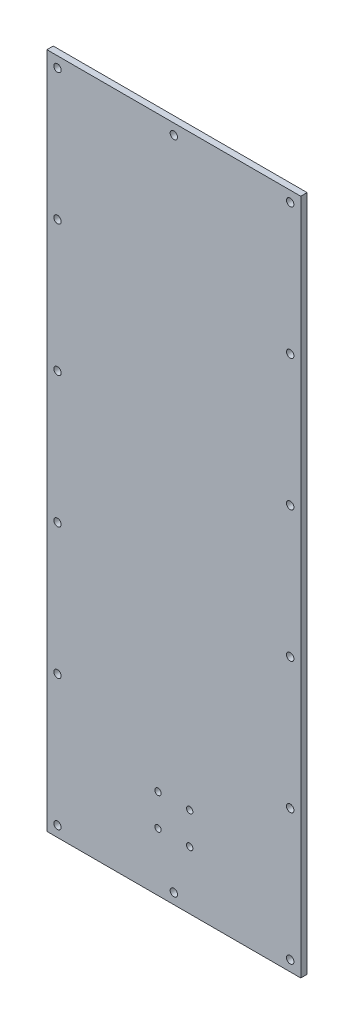
ISO-10303-21;
HEADER;
FILE_DESCRIPTION(('STEP AP214'),'2;1');
FILE_NAME('part.step','',(''),(''),'','','');
FILE_SCHEMA(('AUTOMOTIVE_DESIGN { 1 0 10303 214 1 1 1 1 }'));
ENDSEC;
DATA;
#1=APPLICATION_CONTEXT('core data for automotive mechanical design processes');
#2=APPLICATION_PROTOCOL_DEFINITION('international standard','automotive_design',2000,#1);
#3=PRODUCT_CONTEXT('',#1,'mechanical');
#4=PRODUCT('Part','Part','',(#3));
#5=PRODUCT_RELATED_PRODUCT_CATEGORY('part','',(#4));
#6=PRODUCT_DEFINITION_FORMATION('','',#4);
#7=PRODUCT_DEFINITION_CONTEXT('part definition',#1,'design');
#8=PRODUCT_DEFINITION('design','',#6,#7);
#9=PRODUCT_DEFINITION_SHAPE('','',#8);
#10=(LENGTH_UNIT() NAMED_UNIT(*) SI_UNIT(.MILLI.,.METRE.));
#11=(NAMED_UNIT(*) PLANE_ANGLE_UNIT() SI_UNIT($,.RADIAN.));
#12=(NAMED_UNIT(*) SI_UNIT($,.STERADIAN.) SOLID_ANGLE_UNIT());
#13=UNCERTAINTY_MEASURE_WITH_UNIT(LENGTH_MEASURE(1.E-05),#10,'distance_accuracy_value','');
#14=(GEOMETRIC_REPRESENTATION_CONTEXT(3) GLOBAL_UNCERTAINTY_ASSIGNED_CONTEXT((#13)) GLOBAL_UNIT_ASSIGNED_CONTEXT((#10,
#11,#12)) REPRESENTATION_CONTEXT('',''));
#15=CARTESIAN_POINT('',(0.,0.,0.));
#16=DIRECTION('',(0.,0.,1.));
#17=DIRECTION('',(1.,0.,0.));
#18=AXIS2_PLACEMENT_3D('',#15,#16,#17);
#19=CARTESIAN_POINT('',(-60.,-160.,3.));
#20=DIRECTION('',(1.,0.,0.));
#21=DIRECTION('',(0.,0.,-1.));
#22=AXIS2_PLACEMENT_3D('',#19,#20,#21);
#23=PLANE('',#22);
#24=DIRECTION('',(0.,-1.,0.));
#25=VECTOR('',#24,1.);
#26=CARTESIAN_POINT('',(-60.,-160.,0.));
#27=LINE('',#26,#25);
#28=CARTESIAN_POINT('',(-60.,160.,0.));
#29=VERTEX_POINT('',#28);
#30=CARTESIAN_POINT('',(-60.,-160.,0.));
#31=VERTEX_POINT('',#30);
#32=EDGE_CURVE('E101',#29,#31,#27,.T.);
#33=ORIENTED_EDGE('',*,*,#32,.T.);
#34=DIRECTION('',(0.,0.,-1.));
#35=VECTOR('',#34,1.);
#36=CARTESIAN_POINT('',(-60.,-160.,3.));
#37=LINE('',#36,#35);
#38=CARTESIAN_POINT('',(-60.,-160.,3.));
#39=VERTEX_POINT('',#38);
#40=EDGE_CURVE('E11',#39,#31,#37,.T.);
#41=ORIENTED_EDGE('',*,*,#40,.F.);
#42=DIRECTION('',(0.,-1.,0.));
#43=VECTOR('',#42,1.);
#44=CARTESIAN_POINT('',(-60.,-160.,3.));
#45=LINE('',#44,#43);
#46=CARTESIAN_POINT('',(-60.,160.,3.));
#47=VERTEX_POINT('',#46);
#48=EDGE_CURVE('E88',#47,#39,#45,.T.);
#49=ORIENTED_EDGE('',*,*,#48,.F.);
#50=DIRECTION('',(0.,0.,-1.));
#51=VECTOR('',#50,1.);
#52=CARTESIAN_POINT('',(-60.,160.,3.));
#53=LINE('',#52,#51);
#54=EDGE_CURVE('E97',#47,#29,#53,.T.);
#55=ORIENTED_EDGE('',*,*,#54,.T.);
#56=EDGE_LOOP('',(#33,#41,#49,#55));
#57=FACE_BOUND('',#56,.T.);
#58=ADVANCED_FACE('F35',(#57),#23,.F.);
#59=CARTESIAN_POINT('',(60.,-160.,3.));
#60=DIRECTION('',(0.,1.,0.));
#61=DIRECTION('',(0.,0.,1.));
#62=AXIS2_PLACEMENT_3D('',#59,#60,#61);
#63=PLANE('',#62);
#64=DIRECTION('',(1.,0.,0.));
#65=VECTOR('',#64,1.);
#66=CARTESIAN_POINT('',(60.,-160.,0.));
#67=LINE('',#66,#65);
#68=CARTESIAN_POINT('',(60.,-160.,0.));
#69=VERTEX_POINT('',#68);
#70=EDGE_CURVE('E92',#31,#69,#67,.T.);
#71=ORIENTED_EDGE('',*,*,#70,.T.);
#72=DIRECTION('',(0.,0.,-1.));
#73=VECTOR('',#72,1.);
#74=CARTESIAN_POINT('',(60.,-160.,3.));
#75=LINE('',#74,#73);
#76=CARTESIAN_POINT('',(60.,-160.,3.));
#77=VERTEX_POINT('',#76);
#78=EDGE_CURVE('E44',#77,#69,#75,.T.);
#79=ORIENTED_EDGE('',*,*,#78,.F.);
#80=DIRECTION('',(1.,0.,0.));
#81=VECTOR('',#80,1.);
#82=CARTESIAN_POINT('',(60.,-160.,3.));
#83=LINE('',#82,#81);
#84=EDGE_CURVE('E83',#39,#77,#83,.T.);
#85=ORIENTED_EDGE('',*,*,#84,.F.);
#86=ORIENTED_EDGE('',*,*,#40,.T.);
#87=EDGE_LOOP('',(#71,#79,#85,#86));
#88=FACE_BOUND('',#87,.T.);
#89=ADVANCED_FACE('F91',(#88),#63,.F.);
#90=CARTESIAN_POINT('',(60.,-160.,3.));
#91=DIRECTION('',(-1.,0.,0.));
#92=DIRECTION('',(0.,0.,1.));
#93=AXIS2_PLACEMENT_3D('',#90,#91,#92);
#94=PLANE('',#93);
#95=DIRECTION('',(0.,1.,0.));
#96=VECTOR('',#95,1.);
#97=CARTESIAN_POINT('',(60.,-160.,0.));
#98=LINE('',#97,#96);
#99=CARTESIAN_POINT('',(60.,160.,0.));
#100=VERTEX_POINT('',#99);
#101=EDGE_CURVE('E70',#69,#100,#98,.T.);
#102=ORIENTED_EDGE('',*,*,#101,.T.);
#103=DIRECTION('',(0.,0.,-1.));
#104=VECTOR('',#103,1.);
#105=CARTESIAN_POINT('',(60.,160.,3.));
#106=LINE('',#105,#104);
#107=CARTESIAN_POINT('',(60.,160.,3.));
#108=VERTEX_POINT('',#107);
#109=EDGE_CURVE('E93',#108,#100,#106,.T.);
#110=ORIENTED_EDGE('',*,*,#109,.F.);
#111=DIRECTION('',(0.,1.,0.));
#112=VECTOR('',#111,1.);
#113=CARTESIAN_POINT('',(60.,-160.,3.));
#114=LINE('',#113,#112);
#115=EDGE_CURVE('E86',#77,#108,#114,.T.);
#116=ORIENTED_EDGE('',*,*,#115,.F.);
#117=ORIENTED_EDGE('',*,*,#78,.T.);
#118=EDGE_LOOP('',(#102,#110,#116,#117));
#119=FACE_BOUND('',#118,.T.);
#120=ADVANCED_FACE('F95',(#119),#94,.F.);
#121=CARTESIAN_POINT('',(60.,160.,3.));
#122=DIRECTION('',(0.,-1.,0.));
#123=DIRECTION('',(0.,0.,-1.));
#124=AXIS2_PLACEMENT_3D('',#121,#122,#123);
#125=PLANE('',#124);
#126=DIRECTION('',(-1.,0.,0.));
#127=VECTOR('',#126,1.);
#128=CARTESIAN_POINT('',(60.,160.,0.));
#129=LINE('',#128,#127);
#130=EDGE_CURVE('E76',#100,#29,#129,.T.);
#131=ORIENTED_EDGE('',*,*,#130,.T.);
#132=ORIENTED_EDGE('',*,*,#54,.F.);
#133=DIRECTION('',(-1.,0.,0.));
#134=VECTOR('',#133,1.);
#135=CARTESIAN_POINT('',(60.,160.,3.));
#136=LINE('',#135,#134);
#137=EDGE_CURVE('E53',#108,#47,#136,.T.);
#138=ORIENTED_EDGE('',*,*,#137,.F.);
#139=ORIENTED_EDGE('',*,*,#109,.T.);
#140=EDGE_LOOP('',(#131,#132,#138,#139));
#141=FACE_BOUND('',#140,.T.);
#142=ADVANCED_FACE('F196',(#141),#125,.F.);
#143=CARTESIAN_POINT('',(0.,0.,3.));
#144=DIRECTION('',(0.,0.,1.));
#145=DIRECTION('',(1.,0.,0.));
#146=AXIS2_PLACEMENT_3D('',#143,#144,#145);
#147=PLANE('',#146);
#148=CARTESIAN_POINT('',(55.,-31.0000000000001,3.));
#149=DIRECTION('',(0.,0.,1.));
#150=DIRECTION('',(-1.,0.,0.));
#151=AXIS2_PLACEMENT_3D('',#148,#149,#150);
#152=CIRCLE('',#151,1.74759299465095);
#153=CARTESIAN_POINT('',(53.252407005349,-31.0000000000001,3.));
#154=VERTEX_POINT('',#153);
#155=EDGE_CURVE('E447',#154,#154,#152,.T.);
#156=ORIENTED_EDGE('',*,*,#155,.F.);
#157=EDGE_LOOP('',(#156));
#158=FACE_BOUND('',#157,.T.);
#159=CARTESIAN_POINT('',(55.,31.,3.));
#160=DIRECTION('',(0.,0.,1.));
#161=DIRECTION('',(-1.,0.,0.));
#162=AXIS2_PLACEMENT_3D('',#159,#160,#161);
#163=CIRCLE('',#162,1.74759299465095);
#164=CARTESIAN_POINT('',(53.252407005349,31.,3.));
#165=VERTEX_POINT('',#164);
#166=EDGE_CURVE('E441',#165,#165,#163,.T.);
#167=ORIENTED_EDGE('',*,*,#166,.F.);
#168=EDGE_LOOP('',(#167));
#169=FACE_BOUND('',#168,.T.);
#170=CARTESIAN_POINT('',(55.,93.,3.));
#171=DIRECTION('',(0.,0.,1.));
#172=DIRECTION('',(-1.,0.,0.));
#173=AXIS2_PLACEMENT_3D('',#170,#171,#172);
#174=CIRCLE('',#173,1.74759299465095);
#175=CARTESIAN_POINT('',(53.2524070053491,93.,3.));
#176=VERTEX_POINT('',#175);
#177=EDGE_CURVE('E391',#176,#176,#174,.T.);
#178=ORIENTED_EDGE('',*,*,#177,.F.);
#179=EDGE_LOOP('',(#178));
#180=FACE_BOUND('',#179,.T.);
#181=CARTESIAN_POINT('',(54.9999999999998,-155.,3.));
#182=DIRECTION('',(0.,0.,1.));
#183=DIRECTION('',(-1.,0.,0.));
#184=AXIS2_PLACEMENT_3D('',#181,#182,#183);
#185=CIRCLE('',#184,1.74759299465095);
#186=CARTESIAN_POINT('',(53.2524070053489,-155.,3.));
#187=VERTEX_POINT('',#186);
#188=EDGE_CURVE('E440',#187,#187,#185,.T.);
#189=ORIENTED_EDGE('',*,*,#188,.F.);
#190=EDGE_LOOP('',(#189));
#191=FACE_BOUND('',#190,.T.);
#192=CARTESIAN_POINT('',(7.50000000000001,-132.5,3.));
#193=DIRECTION('',(0.,0.,1.));
#194=DIRECTION('',(1.,0.,0.));
#195=AXIS2_PLACEMENT_3D('',#192,#193,#194);
#196=CIRCLE('',#195,1.5);
#197=CARTESIAN_POINT('',(9.00000000000001,-132.5,3.));
#198=VERTEX_POINT('',#197);
#199=EDGE_CURVE('E497',#198,#198,#196,.T.);
#200=ORIENTED_EDGE('',*,*,#199,.F.);
#201=EDGE_LOOP('',(#200));
#202=FACE_BOUND('',#201,.T.);
#203=CARTESIAN_POINT('',(7.50000000000001,-117.5,3.));
#204=DIRECTION('',(0.,0.,1.));
#205=DIRECTION('',(1.,0.,0.));
#206=AXIS2_PLACEMENT_3D('',#203,#204,#205);
#207=CIRCLE('',#206,1.5);
#208=CARTESIAN_POINT('',(9.00000000000001,-117.5,3.));
#209=VERTEX_POINT('',#208);
#210=EDGE_CURVE('E500',#209,#209,#207,.T.);
#211=ORIENTED_EDGE('',*,*,#210,.F.);
#212=EDGE_LOOP('',(#211));
#213=FACE_BOUND('',#212,.T.);
#214=CARTESIAN_POINT('',(-7.49999999999999,-117.5,3.));
#215=DIRECTION('',(0.,0.,1.));
#216=DIRECTION('',(1.,0.,0.));
#217=AXIS2_PLACEMENT_3D('',#214,#215,#216);
#218=CIRCLE('',#217,1.5);
#219=CARTESIAN_POINT('',(-5.99999999999999,-117.5,3.));
#220=VERTEX_POINT('',#219);
#221=EDGE_CURVE('E504',#220,#220,#218,.T.);
#222=ORIENTED_EDGE('',*,*,#221,.F.);
#223=EDGE_LOOP('',(#222));
#224=FACE_BOUND('',#223,.T.);
#225=CARTESIAN_POINT('',(55.,-93.0000000000001,3.));
#226=DIRECTION('',(0.,0.,1.));
#227=DIRECTION('',(-1.,0.,0.));
#228=AXIS2_PLACEMENT_3D('',#225,#226,#227);
#229=CIRCLE('',#228,1.74759299465095);
#230=CARTESIAN_POINT('',(53.252407005349,-93.0000000000001,3.));
#231=VERTEX_POINT('',#230);
#232=EDGE_CURVE('E506',#231,#231,#229,.T.);
#233=ORIENTED_EDGE('',*,*,#232,.F.);
#234=EDGE_LOOP('',(#233));
#235=FACE_BOUND('',#234,.T.);
#236=CARTESIAN_POINT('',(-1.43403807347416E-13,-155.,3.));
#237=DIRECTION('',(0.,0.,1.));
#238=DIRECTION('',(-1.,0.,0.));
#239=AXIS2_PLACEMENT_3D('',#236,#237,#238);
#240=CIRCLE('',#239,1.74759299465095);
#241=CARTESIAN_POINT('',(-1.74759299465109,-155.,3.));
#242=VERTEX_POINT('',#241);
#243=EDGE_CURVE('E444',#242,#242,#240,.T.);
#244=ORIENTED_EDGE('',*,*,#243,.F.);
#245=EDGE_LOOP('',(#244));
#246=FACE_BOUND('',#245,.T.);
#247=CARTESIAN_POINT('',(-55.,-155.,3.));
#248=DIRECTION('',(0.,0.,1.));
#249=DIRECTION('',(1.,0.,0.));
#250=AXIS2_PLACEMENT_3D('',#247,#248,#249);
#251=CIRCLE('',#250,1.74759299465095);
#252=CARTESIAN_POINT('',(-53.252407005349,-155.,3.));
#253=VERTEX_POINT('',#252);
#254=EDGE_CURVE('E469',#253,#253,#251,.T.);
#255=ORIENTED_EDGE('',*,*,#254,.F.);
#256=EDGE_LOOP('',(#255));
#257=FACE_BOUND('',#256,.T.);
#258=CARTESIAN_POINT('',(-55.,-93.0000000000001,3.));
#259=DIRECTION('',(0.,0.,1.));
#260=DIRECTION('',(1.,0.,0.));
#261=AXIS2_PLACEMENT_3D('',#258,#259,#260);
#262=CIRCLE('',#261,1.74759299465095);
#263=CARTESIAN_POINT('',(-53.252407005349,-93.0000000000001,3.));
#264=VERTEX_POINT('',#263);
#265=EDGE_CURVE('E466',#264,#264,#262,.T.);
#266=ORIENTED_EDGE('',*,*,#265,.F.);
#267=EDGE_LOOP('',(#266));
#268=FACE_BOUND('',#267,.T.);
#269=CARTESIAN_POINT('',(-55.,-31.0000000000001,3.));
#270=DIRECTION('',(0.,0.,1.));
#271=DIRECTION('',(1.,0.,0.));
#272=AXIS2_PLACEMENT_3D('',#269,#270,#271);
#273=CIRCLE('',#272,1.74759299465095);
#274=CARTESIAN_POINT('',(-53.252407005349,-31.0000000000001,3.));
#275=VERTEX_POINT('',#274);
#276=EDGE_CURVE('E463',#275,#275,#273,.T.);
#277=ORIENTED_EDGE('',*,*,#276,.F.);
#278=EDGE_LOOP('',(#277));
#279=FACE_BOUND('',#278,.T.);
#280=CARTESIAN_POINT('',(-55.,31.,3.));
#281=DIRECTION('',(0.,0.,1.));
#282=DIRECTION('',(1.,0.,0.));
#283=AXIS2_PLACEMENT_3D('',#280,#281,#282);
#284=CIRCLE('',#283,1.74759299465095);
#285=CARTESIAN_POINT('',(-53.252407005349,31.,3.));
#286=VERTEX_POINT('',#285);
#287=EDGE_CURVE('E460',#286,#286,#284,.T.);
#288=ORIENTED_EDGE('',*,*,#287,.F.);
#289=EDGE_LOOP('',(#288));
#290=FACE_BOUND('',#289,.T.);
#291=CARTESIAN_POINT('',(-55.,93.,3.));
#292=DIRECTION('',(0.,0.,1.));
#293=DIRECTION('',(1.,0.,0.));
#294=AXIS2_PLACEMENT_3D('',#291,#292,#293);
#295=CIRCLE('',#294,1.74759299465095);
#296=CARTESIAN_POINT('',(-53.252407005349,93.,3.));
#297=VERTEX_POINT('',#296);
#298=EDGE_CURVE('E457',#297,#297,#295,.T.);
#299=ORIENTED_EDGE('',*,*,#298,.F.);
#300=EDGE_LOOP('',(#299));
#301=FACE_BOUND('',#300,.T.);
#302=CARTESIAN_POINT('',(55.,155.,3.));
#303=DIRECTION('',(0.,0.,1.));
#304=DIRECTION('',(1.,0.,0.));
#305=AXIS2_PLACEMENT_3D('',#302,#303,#304);
#306=CIRCLE('',#305,1.74759299465095);
#307=CARTESIAN_POINT('',(56.7475929946509,155.,3.));
#308=VERTEX_POINT('',#307);
#309=EDGE_CURVE('E454',#308,#308,#306,.T.);
#310=ORIENTED_EDGE('',*,*,#309,.F.);
#311=EDGE_LOOP('',(#310));
#312=FACE_BOUND('',#311,.T.);
#313=CARTESIAN_POINT('',(0.,155.,3.));
#314=DIRECTION('',(0.,0.,1.));
#315=DIRECTION('',(1.,0.,0.));
#316=AXIS2_PLACEMENT_3D('',#313,#314,#315);
#317=CIRCLE('',#316,1.74759299465095);
#318=CARTESIAN_POINT('',(1.74759299465095,155.,3.));
#319=VERTEX_POINT('',#318);
#320=EDGE_CURVE('E451',#319,#319,#317,.T.);
#321=ORIENTED_EDGE('',*,*,#320,.F.);
#322=EDGE_LOOP('',(#321));
#323=FACE_BOUND('',#322,.T.);
#324=CARTESIAN_POINT('',(-7.49999999999999,-132.5,3.));
#325=DIRECTION('',(0.,0.,1.));
#326=DIRECTION('',(1.,0.,0.));
#327=AXIS2_PLACEMENT_3D('',#324,#325,#326);
#328=CIRCLE('',#327,1.5);
#329=CARTESIAN_POINT('',(-5.99999999999999,-132.5,3.));
#330=VERTEX_POINT('',#329);
#331=EDGE_CURVE('E496',#330,#330,#328,.T.);
#332=ORIENTED_EDGE('',*,*,#331,.F.);
#333=EDGE_LOOP('',(#332));
#334=FACE_BOUND('',#333,.T.);
#335=CARTESIAN_POINT('',(-55.,155.,3.));
#336=DIRECTION('',(0.,0.,1.));
#337=DIRECTION('',(1.,0.,0.));
#338=AXIS2_PLACEMENT_3D('',#335,#336,#337);
#339=CIRCLE('',#338,1.74759299465095);
#340=CARTESIAN_POINT('',(-53.2524070053491,155.,3.));
#341=VERTEX_POINT('',#340);
#342=EDGE_CURVE('E113',#341,#341,#339,.T.);
#343=ORIENTED_EDGE('',*,*,#342,.F.);
#344=EDGE_LOOP('',(#343));
#345=FACE_BOUND('',#344,.T.);
#346=ORIENTED_EDGE('',*,*,#48,.T.);
#347=ORIENTED_EDGE('',*,*,#84,.T.);
#348=ORIENTED_EDGE('',*,*,#115,.T.);
#349=ORIENTED_EDGE('',*,*,#137,.T.);
#350=EDGE_LOOP('',(#346,#347,#348,#349));
#351=FACE_BOUND('',#350,.T.);
#352=ADVANCED_FACE('F84',(#158,#169,#180,#191,#202,#213,#224,#235,#246,#257,#268,#279,#290,#301,
#312,#323,#334,#345,#351),#147,.T.);
#353=CARTESIAN_POINT('',(0.,0.,0.));
#354=DIRECTION('',(0.,0.,1.));
#355=DIRECTION('',(1.,0.,0.));
#356=AXIS2_PLACEMENT_3D('',#353,#354,#355);
#357=PLANE('',#356);
#358=CARTESIAN_POINT('',(55.,-31.0000000000001,0.));
#359=DIRECTION('',(0.,0.,1.));
#360=DIRECTION('',(1.,0.,0.));
#361=AXIS2_PLACEMENT_3D('',#358,#359,#360);
#362=CIRCLE('',#361,1.74759299465095);
#363=CARTESIAN_POINT('',(56.7475929946509,-31.0000000000001,0.));
#364=VERTEX_POINT('',#363);
#365=EDGE_CURVE('E38',#364,#364,#362,.T.);
#366=ORIENTED_EDGE('',*,*,#365,.T.);
#367=EDGE_LOOP('',(#366));
#368=FACE_BOUND('',#367,.T.);
#369=CARTESIAN_POINT('',(55.,31.,0.));
#370=DIRECTION('',(0.,0.,1.));
#371=DIRECTION('',(1.,0.,0.));
#372=AXIS2_PLACEMENT_3D('',#369,#370,#371);
#373=CIRCLE('',#372,1.74759299465095);
#374=CARTESIAN_POINT('',(56.7475929946509,31.,0.));
#375=VERTEX_POINT('',#374);
#376=EDGE_CURVE('E157',#375,#375,#373,.T.);
#377=ORIENTED_EDGE('',*,*,#376,.T.);
#378=EDGE_LOOP('',(#377));
#379=FACE_BOUND('',#378,.T.);
#380=CARTESIAN_POINT('',(55.,93.,0.));
#381=DIRECTION('',(0.,0.,1.));
#382=DIRECTION('',(1.,0.,0.));
#383=AXIS2_PLACEMENT_3D('',#380,#381,#382);
#384=CIRCLE('',#383,1.74759299465095);
#385=CARTESIAN_POINT('',(56.747592994651,93.,0.));
#386=VERTEX_POINT('',#385);
#387=EDGE_CURVE('E155',#386,#386,#384,.T.);
#388=ORIENTED_EDGE('',*,*,#387,.T.);
#389=EDGE_LOOP('',(#388));
#390=FACE_BOUND('',#389,.T.);
#391=CARTESIAN_POINT('',(54.9999999999998,-155.,0.));
#392=DIRECTION('',(0.,0.,1.));
#393=DIRECTION('',(1.,0.,0.));
#394=AXIS2_PLACEMENT_3D('',#391,#392,#393);
#395=CIRCLE('',#394,1.74759299465095);
#396=CARTESIAN_POINT('',(56.7475929946508,-155.,0.));
#397=VERTEX_POINT('',#396);
#398=EDGE_CURVE('E152',#397,#397,#395,.T.);
#399=ORIENTED_EDGE('',*,*,#398,.T.);
#400=EDGE_LOOP('',(#399));
#401=FACE_BOUND('',#400,.T.);
#402=CARTESIAN_POINT('',(7.50000000000001,-132.5,0.));
#403=DIRECTION('',(0.,0.,1.));
#404=DIRECTION('',(1.,0.,0.));
#405=AXIS2_PLACEMENT_3D('',#402,#403,#404);
#406=CIRCLE('',#405,1.5);
#407=CARTESIAN_POINT('',(9.00000000000001,-132.5,0.));
#408=VERTEX_POINT('',#407);
#409=EDGE_CURVE('E149',#408,#408,#406,.T.);
#410=ORIENTED_EDGE('',*,*,#409,.T.);
#411=EDGE_LOOP('',(#410));
#412=FACE_BOUND('',#411,.T.);
#413=CARTESIAN_POINT('',(7.50000000000001,-117.5,0.));
#414=DIRECTION('',(0.,0.,1.));
#415=DIRECTION('',(1.,0.,0.));
#416=AXIS2_PLACEMENT_3D('',#413,#414,#415);
#417=CIRCLE('',#416,1.5);
#418=CARTESIAN_POINT('',(9.00000000000001,-117.5,0.));
#419=VERTEX_POINT('',#418);
#420=EDGE_CURVE('E146',#419,#419,#417,.T.);
#421=ORIENTED_EDGE('',*,*,#420,.T.);
#422=EDGE_LOOP('',(#421));
#423=FACE_BOUND('',#422,.T.);
#424=CARTESIAN_POINT('',(-7.49999999999999,-117.5,0.));
#425=DIRECTION('',(0.,0.,1.));
#426=DIRECTION('',(1.,0.,0.));
#427=AXIS2_PLACEMENT_3D('',#424,#425,#426);
#428=CIRCLE('',#427,1.5);
#429=CARTESIAN_POINT('',(-5.99999999999999,-117.5,0.));
#430=VERTEX_POINT('',#429);
#431=EDGE_CURVE('E143',#430,#430,#428,.T.);
#432=ORIENTED_EDGE('',*,*,#431,.T.);
#433=EDGE_LOOP('',(#432));
#434=FACE_BOUND('',#433,.T.);
#435=CARTESIAN_POINT('',(55.,-93.0000000000001,0.));
#436=DIRECTION('',(0.,0.,1.));
#437=DIRECTION('',(1.,0.,0.));
#438=AXIS2_PLACEMENT_3D('',#435,#436,#437);
#439=CIRCLE('',#438,1.74759299465095);
#440=CARTESIAN_POINT('',(56.7475929946509,-93.0000000000001,0.));
#441=VERTEX_POINT('',#440);
#442=EDGE_CURVE('E140',#441,#441,#439,.T.);
#443=ORIENTED_EDGE('',*,*,#442,.T.);
#444=EDGE_LOOP('',(#443));
#445=FACE_BOUND('',#444,.T.);
#446=CARTESIAN_POINT('',(-1.43403807347416E-13,-155.,0.));
#447=DIRECTION('',(0.,0.,1.));
#448=DIRECTION('',(1.,0.,0.));
#449=AXIS2_PLACEMENT_3D('',#446,#447,#448);
#450=CIRCLE('',#449,1.74759299465095);
#451=CARTESIAN_POINT('',(1.7475929946508,-155.,0.));
#452=VERTEX_POINT('',#451);
#453=EDGE_CURVE('E137',#452,#452,#450,.T.);
#454=ORIENTED_EDGE('',*,*,#453,.T.);
#455=EDGE_LOOP('',(#454));
#456=FACE_BOUND('',#455,.T.);
#457=CARTESIAN_POINT('',(-55.,-155.,0.));
#458=DIRECTION('',(0.,0.,1.));
#459=DIRECTION('',(1.,0.,0.));
#460=AXIS2_PLACEMENT_3D('',#457,#458,#459);
#461=CIRCLE('',#460,1.74759299465095);
#462=CARTESIAN_POINT('',(-53.252407005349,-155.,0.));
#463=VERTEX_POINT('',#462);
#464=EDGE_CURVE('E134',#463,#463,#461,.T.);
#465=ORIENTED_EDGE('',*,*,#464,.T.);
#466=EDGE_LOOP('',(#465));
#467=FACE_BOUND('',#466,.T.);
#468=CARTESIAN_POINT('',(-55.,-93.0000000000001,0.));
#469=DIRECTION('',(0.,0.,1.));
#470=DIRECTION('',(1.,0.,0.));
#471=AXIS2_PLACEMENT_3D('',#468,#469,#470);
#472=CIRCLE('',#471,1.74759299465095);
#473=CARTESIAN_POINT('',(-53.252407005349,-93.0000000000001,0.));
#474=VERTEX_POINT('',#473);
#475=EDGE_CURVE('E131',#474,#474,#472,.T.);
#476=ORIENTED_EDGE('',*,*,#475,.T.);
#477=EDGE_LOOP('',(#476));
#478=FACE_BOUND('',#477,.T.);
#479=CARTESIAN_POINT('',(-55.,-31.0000000000001,0.));
#480=DIRECTION('',(0.,0.,1.));
#481=DIRECTION('',(1.,0.,0.));
#482=AXIS2_PLACEMENT_3D('',#479,#480,#481);
#483=CIRCLE('',#482,1.74759299465095);
#484=CARTESIAN_POINT('',(-53.252407005349,-31.0000000000001,0.));
#485=VERTEX_POINT('',#484);
#486=EDGE_CURVE('E128',#485,#485,#483,.T.);
#487=ORIENTED_EDGE('',*,*,#486,.T.);
#488=EDGE_LOOP('',(#487));
#489=FACE_BOUND('',#488,.T.);
#490=CARTESIAN_POINT('',(-55.,31.,0.));
#491=DIRECTION('',(0.,0.,1.));
#492=DIRECTION('',(1.,0.,0.));
#493=AXIS2_PLACEMENT_3D('',#490,#491,#492);
#494=CIRCLE('',#493,1.74759299465095);
#495=CARTESIAN_POINT('',(-53.252407005349,31.,0.));
#496=VERTEX_POINT('',#495);
#497=EDGE_CURVE('E125',#496,#496,#494,.T.);
#498=ORIENTED_EDGE('',*,*,#497,.T.);
#499=EDGE_LOOP('',(#498));
#500=FACE_BOUND('',#499,.T.);
#501=CARTESIAN_POINT('',(-55.,93.,0.));
#502=DIRECTION('',(0.,0.,1.));
#503=DIRECTION('',(1.,0.,0.));
#504=AXIS2_PLACEMENT_3D('',#501,#502,#503);
#505=CIRCLE('',#504,1.74759299465095);
#506=CARTESIAN_POINT('',(-53.252407005349,93.,0.));
#507=VERTEX_POINT('',#506);
#508=EDGE_CURVE('E122',#507,#507,#505,.T.);
#509=ORIENTED_EDGE('',*,*,#508,.T.);
#510=EDGE_LOOP('',(#509));
#511=FACE_BOUND('',#510,.T.);
#512=CARTESIAN_POINT('',(55.,155.,0.));
#513=DIRECTION('',(0.,0.,1.));
#514=DIRECTION('',(1.,0.,0.));
#515=AXIS2_PLACEMENT_3D('',#512,#513,#514);
#516=CIRCLE('',#515,1.74759299465095);
#517=CARTESIAN_POINT('',(56.7475929946509,155.,0.));
#518=VERTEX_POINT('',#517);
#519=EDGE_CURVE('E119',#518,#518,#516,.T.);
#520=ORIENTED_EDGE('',*,*,#519,.T.);
#521=EDGE_LOOP('',(#520));
#522=FACE_BOUND('',#521,.T.);
#523=CARTESIAN_POINT('',(0.,155.,0.));
#524=DIRECTION('',(0.,0.,1.));
#525=DIRECTION('',(1.,0.,0.));
#526=AXIS2_PLACEMENT_3D('',#523,#524,#525);
#527=CIRCLE('',#526,1.74759299465095);
#528=CARTESIAN_POINT('',(1.74759299465095,155.,0.));
#529=VERTEX_POINT('',#528);
#530=EDGE_CURVE('E116',#529,#529,#527,.T.);
#531=ORIENTED_EDGE('',*,*,#530,.T.);
#532=EDGE_LOOP('',(#531));
#533=FACE_BOUND('',#532,.T.);
#534=CARTESIAN_POINT('',(-7.49999999999999,-132.5,0.));
#535=DIRECTION('',(0.,0.,1.));
#536=DIRECTION('',(1.,0.,0.));
#537=AXIS2_PLACEMENT_3D('',#534,#535,#536);
#538=CIRCLE('',#537,1.5);
#539=CARTESIAN_POINT('',(-5.99999999999999,-132.5,0.));
#540=VERTEX_POINT('',#539);
#541=EDGE_CURVE('E112',#540,#540,#538,.T.);
#542=ORIENTED_EDGE('',*,*,#541,.T.);
#543=EDGE_LOOP('',(#542));
#544=FACE_BOUND('',#543,.T.);
#545=CARTESIAN_POINT('',(-55.,155.,0.));
#546=DIRECTION('',(0.,0.,1.));
#547=DIRECTION('',(1.,0.,0.));
#548=AXIS2_PLACEMENT_3D('',#545,#546,#547);
#549=CIRCLE('',#548,1.74759299465095);
#550=CARTESIAN_POINT('',(-53.2524070053491,155.,0.));
#551=VERTEX_POINT('',#550);
#552=EDGE_CURVE('E109',#551,#551,#549,.T.);
#553=ORIENTED_EDGE('',*,*,#552,.T.);
#554=EDGE_LOOP('',(#553));
#555=FACE_BOUND('',#554,.T.);
#556=ORIENTED_EDGE('',*,*,#32,.F.);
#557=ORIENTED_EDGE('',*,*,#130,.F.);
#558=ORIENTED_EDGE('',*,*,#101,.F.);
#559=ORIENTED_EDGE('',*,*,#70,.F.);
#560=EDGE_LOOP('',(#556,#557,#558,#559));
#561=FACE_BOUND('',#560,.T.);
#562=ADVANCED_FACE('F164',(#368,#379,#390,#401,#412,#423,#434,#445,#456,#467,#478,#489,#500,
#511,#522,#533,#544,#555,#561),#357,.F.);
#563=CARTESIAN_POINT('',(-55.,155.,-7.));
#564=DIRECTION('',(0.,0.,1.));
#565=DIRECTION('',(1.,0.,0.));
#566=AXIS2_PLACEMENT_3D('',#563,#564,#565);
#567=CYLINDRICAL_SURFACE('',#566,1.74759299465095);
#568=ORIENTED_EDGE('',*,*,#342,.T.);
#569=EDGE_LOOP('',(#568));
#570=FACE_BOUND('',#569,.T.);
#571=ORIENTED_EDGE('',*,*,#552,.F.);
#572=EDGE_LOOP('',(#571));
#573=FACE_BOUND('',#572,.T.);
#574=ADVANCED_FACE('F187',(#570,#573),#567,.F.);
#575=CARTESIAN_POINT('',(-7.49999999999999,-132.5,-7.));
#576=DIRECTION('',(0.,0.,1.));
#577=DIRECTION('',(1.,0.,0.));
#578=AXIS2_PLACEMENT_3D('',#575,#576,#577);
#579=CYLINDRICAL_SURFACE('',#578,1.5);
#580=ORIENTED_EDGE('',*,*,#331,.T.);
#581=EDGE_LOOP('',(#580));
#582=FACE_BOUND('',#581,.T.);
#583=ORIENTED_EDGE('',*,*,#541,.F.);
#584=EDGE_LOOP('',(#583));
#585=FACE_BOUND('',#584,.T.);
#586=ADVANCED_FACE('F193',(#582,#585),#579,.F.);
#587=CARTESIAN_POINT('',(0.,155.,-7.));
#588=DIRECTION('',(0.,0.,1.));
#589=DIRECTION('',(1.,0.,0.));
#590=AXIS2_PLACEMENT_3D('',#587,#588,#589);
#591=CYLINDRICAL_SURFACE('',#590,1.74759299465095);
#592=ORIENTED_EDGE('',*,*,#320,.T.);
#593=EDGE_LOOP('',(#592));
#594=FACE_BOUND('',#593,.T.);
#595=ORIENTED_EDGE('',*,*,#530,.F.);
#596=EDGE_LOOP('',(#595));
#597=FACE_BOUND('',#596,.T.);
#598=ADVANCED_FACE('F236',(#594,#597),#591,.F.);
#599=CARTESIAN_POINT('',(55.,155.,-7.));
#600=DIRECTION('',(0.,0.,1.));
#601=DIRECTION('',(1.,0.,0.));
#602=AXIS2_PLACEMENT_3D('',#599,#600,#601);
#603=CYLINDRICAL_SURFACE('',#602,1.74759299465095);
#604=ORIENTED_EDGE('',*,*,#309,.T.);
#605=EDGE_LOOP('',(#604));
#606=FACE_BOUND('',#605,.T.);
#607=ORIENTED_EDGE('',*,*,#519,.F.);
#608=EDGE_LOOP('',(#607));
#609=FACE_BOUND('',#608,.T.);
#610=ADVANCED_FACE('F246',(#606,#609),#603,.F.);
#611=CARTESIAN_POINT('',(-55.,93.,-7.));
#612=DIRECTION('',(0.,0.,1.));
#613=DIRECTION('',(1.,0.,0.));
#614=AXIS2_PLACEMENT_3D('',#611,#612,#613);
#615=CYLINDRICAL_SURFACE('',#614,1.74759299465095);
#616=ORIENTED_EDGE('',*,*,#298,.T.);
#617=EDGE_LOOP('',(#616));
#618=FACE_BOUND('',#617,.T.);
#619=ORIENTED_EDGE('',*,*,#508,.F.);
#620=EDGE_LOOP('',(#619));
#621=FACE_BOUND('',#620,.T.);
#622=ADVANCED_FACE('F256',(#618,#621),#615,.F.);
#623=CARTESIAN_POINT('',(-55.,31.,-7.));
#624=DIRECTION('',(0.,0.,1.));
#625=DIRECTION('',(1.,0.,0.));
#626=AXIS2_PLACEMENT_3D('',#623,#624,#625);
#627=CYLINDRICAL_SURFACE('',#626,1.74759299465095);
#628=ORIENTED_EDGE('',*,*,#287,.T.);
#629=EDGE_LOOP('',(#628));
#630=FACE_BOUND('',#629,.T.);
#631=ORIENTED_EDGE('',*,*,#497,.F.);
#632=EDGE_LOOP('',(#631));
#633=FACE_BOUND('',#632,.T.);
#634=ADVANCED_FACE('F266',(#630,#633),#627,.F.);
#635=CARTESIAN_POINT('',(-55.,-31.0000000000001,-7.));
#636=DIRECTION('',(0.,0.,1.));
#637=DIRECTION('',(1.,0.,0.));
#638=AXIS2_PLACEMENT_3D('',#635,#636,#637);
#639=CYLINDRICAL_SURFACE('',#638,1.74759299465095);
#640=ORIENTED_EDGE('',*,*,#276,.T.);
#641=EDGE_LOOP('',(#640));
#642=FACE_BOUND('',#641,.T.);
#643=ORIENTED_EDGE('',*,*,#486,.F.);
#644=EDGE_LOOP('',(#643));
#645=FACE_BOUND('',#644,.T.);
#646=ADVANCED_FACE('F276',(#642,#645),#639,.F.);
#647=CARTESIAN_POINT('',(-55.,-93.0000000000001,-7.));
#648=DIRECTION('',(0.,0.,1.));
#649=DIRECTION('',(1.,0.,0.));
#650=AXIS2_PLACEMENT_3D('',#647,#648,#649);
#651=CYLINDRICAL_SURFACE('',#650,1.74759299465095);
#652=ORIENTED_EDGE('',*,*,#265,.T.);
#653=EDGE_LOOP('',(#652));
#654=FACE_BOUND('',#653,.T.);
#655=ORIENTED_EDGE('',*,*,#475,.F.);
#656=EDGE_LOOP('',(#655));
#657=FACE_BOUND('',#656,.T.);
#658=ADVANCED_FACE('F286',(#654,#657),#651,.F.);
#659=CARTESIAN_POINT('',(-55.,-155.,-7.));
#660=DIRECTION('',(0.,0.,1.));
#661=DIRECTION('',(1.,0.,0.));
#662=AXIS2_PLACEMENT_3D('',#659,#660,#661);
#663=CYLINDRICAL_SURFACE('',#662,1.74759299465095);
#664=ORIENTED_EDGE('',*,*,#254,.T.);
#665=EDGE_LOOP('',(#664));
#666=FACE_BOUND('',#665,.T.);
#667=ORIENTED_EDGE('',*,*,#464,.F.);
#668=EDGE_LOOP('',(#667));
#669=FACE_BOUND('',#668,.T.);
#670=ADVANCED_FACE('F296',(#666,#669),#663,.F.);
#671=CARTESIAN_POINT('',(-1.43403807347416E-13,-155.,-7.));
#672=DIRECTION('',(0.,0.,1.));
#673=DIRECTION('',(1.,0.,0.));
#674=AXIS2_PLACEMENT_3D('',#671,#672,#673);
#675=CYLINDRICAL_SURFACE('',#674,1.74759299465095);
#676=ORIENTED_EDGE('',*,*,#243,.T.);
#677=EDGE_LOOP('',(#676));
#678=FACE_BOUND('',#677,.T.);
#679=ORIENTED_EDGE('',*,*,#453,.F.);
#680=EDGE_LOOP('',(#679));
#681=FACE_BOUND('',#680,.T.);
#682=ADVANCED_FACE('F306',(#678,#681),#675,.F.);
#683=CARTESIAN_POINT('',(55.,-93.0000000000001,-7.));
#684=DIRECTION('',(0.,0.,1.));
#685=DIRECTION('',(1.,0.,0.));
#686=AXIS2_PLACEMENT_3D('',#683,#684,#685);
#687=CYLINDRICAL_SURFACE('',#686,1.74759299465095);
#688=ORIENTED_EDGE('',*,*,#232,.T.);
#689=EDGE_LOOP('',(#688));
#690=FACE_BOUND('',#689,.T.);
#691=ORIENTED_EDGE('',*,*,#442,.F.);
#692=EDGE_LOOP('',(#691));
#693=FACE_BOUND('',#692,.T.);
#694=ADVANCED_FACE('F316',(#690,#693),#687,.F.);
#695=CARTESIAN_POINT('',(-7.49999999999999,-117.5,-7.));
#696=DIRECTION('',(0.,0.,1.));
#697=DIRECTION('',(1.,0.,0.));
#698=AXIS2_PLACEMENT_3D('',#695,#696,#697);
#699=CYLINDRICAL_SURFACE('',#698,1.5);
#700=ORIENTED_EDGE('',*,*,#221,.T.);
#701=EDGE_LOOP('',(#700));
#702=FACE_BOUND('',#701,.T.);
#703=ORIENTED_EDGE('',*,*,#431,.F.);
#704=EDGE_LOOP('',(#703));
#705=FACE_BOUND('',#704,.T.);
#706=ADVANCED_FACE('F326',(#702,#705),#699,.F.);
#707=CARTESIAN_POINT('',(7.50000000000001,-117.5,-7.));
#708=DIRECTION('',(0.,0.,1.));
#709=DIRECTION('',(1.,0.,0.));
#710=AXIS2_PLACEMENT_3D('',#707,#708,#709);
#711=CYLINDRICAL_SURFACE('',#710,1.5);
#712=ORIENTED_EDGE('',*,*,#210,.T.);
#713=EDGE_LOOP('',(#712));
#714=FACE_BOUND('',#713,.T.);
#715=ORIENTED_EDGE('',*,*,#420,.F.);
#716=EDGE_LOOP('',(#715));
#717=FACE_BOUND('',#716,.T.);
#718=ADVANCED_FACE('F336',(#714,#717),#711,.F.);
#719=CARTESIAN_POINT('',(7.50000000000001,-132.5,-7.));
#720=DIRECTION('',(0.,0.,1.));
#721=DIRECTION('',(1.,0.,0.));
#722=AXIS2_PLACEMENT_3D('',#719,#720,#721);
#723=CYLINDRICAL_SURFACE('',#722,1.5);
#724=ORIENTED_EDGE('',*,*,#199,.T.);
#725=EDGE_LOOP('',(#724));
#726=FACE_BOUND('',#725,.T.);
#727=ORIENTED_EDGE('',*,*,#409,.F.);
#728=EDGE_LOOP('',(#727));
#729=FACE_BOUND('',#728,.T.);
#730=ADVANCED_FACE('F346',(#726,#729),#723,.F.);
#731=CARTESIAN_POINT('',(54.9999999999998,-155.,-7.));
#732=DIRECTION('',(0.,0.,1.));
#733=DIRECTION('',(1.,0.,0.));
#734=AXIS2_PLACEMENT_3D('',#731,#732,#733);
#735=CYLINDRICAL_SURFACE('',#734,1.74759299465095);
#736=ORIENTED_EDGE('',*,*,#188,.T.);
#737=EDGE_LOOP('',(#736));
#738=FACE_BOUND('',#737,.T.);
#739=ORIENTED_EDGE('',*,*,#398,.F.);
#740=EDGE_LOOP('',(#739));
#741=FACE_BOUND('',#740,.T.);
#742=ADVANCED_FACE('F356',(#738,#741),#735,.F.);
#743=CARTESIAN_POINT('',(55.,93.,-7.));
#744=DIRECTION('',(0.,0.,1.));
#745=DIRECTION('',(1.,0.,0.));
#746=AXIS2_PLACEMENT_3D('',#743,#744,#745);
#747=CYLINDRICAL_SURFACE('',#746,1.74759299465095);
#748=ORIENTED_EDGE('',*,*,#177,.T.);
#749=EDGE_LOOP('',(#748));
#750=FACE_BOUND('',#749,.T.);
#751=ORIENTED_EDGE('',*,*,#387,.F.);
#752=EDGE_LOOP('',(#751));
#753=FACE_BOUND('',#752,.T.);
#754=ADVANCED_FACE('F174',(#750,#753),#747,.F.);
#755=CARTESIAN_POINT('',(55.,31.,-7.));
#756=DIRECTION('',(0.,0.,1.));
#757=DIRECTION('',(1.,0.,0.));
#758=AXIS2_PLACEMENT_3D('',#755,#756,#757);
#759=CYLINDRICAL_SURFACE('',#758,1.74759299465095);
#760=ORIENTED_EDGE('',*,*,#166,.T.);
#761=EDGE_LOOP('',(#760));
#762=FACE_BOUND('',#761,.T.);
#763=ORIENTED_EDGE('',*,*,#376,.F.);
#764=EDGE_LOOP('',(#763));
#765=FACE_BOUND('',#764,.T.);
#766=ADVANCED_FACE('F168',(#762,#765),#759,.F.);
#767=CARTESIAN_POINT('',(55.,-31.0000000000001,-7.));
#768=DIRECTION('',(0.,0.,1.));
#769=DIRECTION('',(1.,0.,0.));
#770=AXIS2_PLACEMENT_3D('',#767,#768,#769);
#771=CYLINDRICAL_SURFACE('',#770,1.74759299465095);
#772=ORIENTED_EDGE('',*,*,#155,.T.);
#773=EDGE_LOOP('',(#772));
#774=FACE_BOUND('',#773,.T.);
#775=ORIENTED_EDGE('',*,*,#365,.F.);
#776=EDGE_LOOP('',(#775));
#777=FACE_BOUND('',#776,.T.);
#778=ADVANCED_FACE('F166',(#774,#777),#771,.F.);
#779=CLOSED_SHELL('',(#58,#89,#120,#142,#352,#562,#574,#586,#598,#610,#622,#634,#646,#658,#670,
#682,#694,#706,#718,#730,#742,#754,#766,#778));
#780=MANIFOLD_SOLID_BREP('B2',#779);
#781=ADVANCED_BREP_SHAPE_REPRESENTATION('',(#18,#780),#14);
#782=SHAPE_DEFINITION_REPRESENTATION(#9,#781);
ENDSEC;
END-ISO-10303-21;
